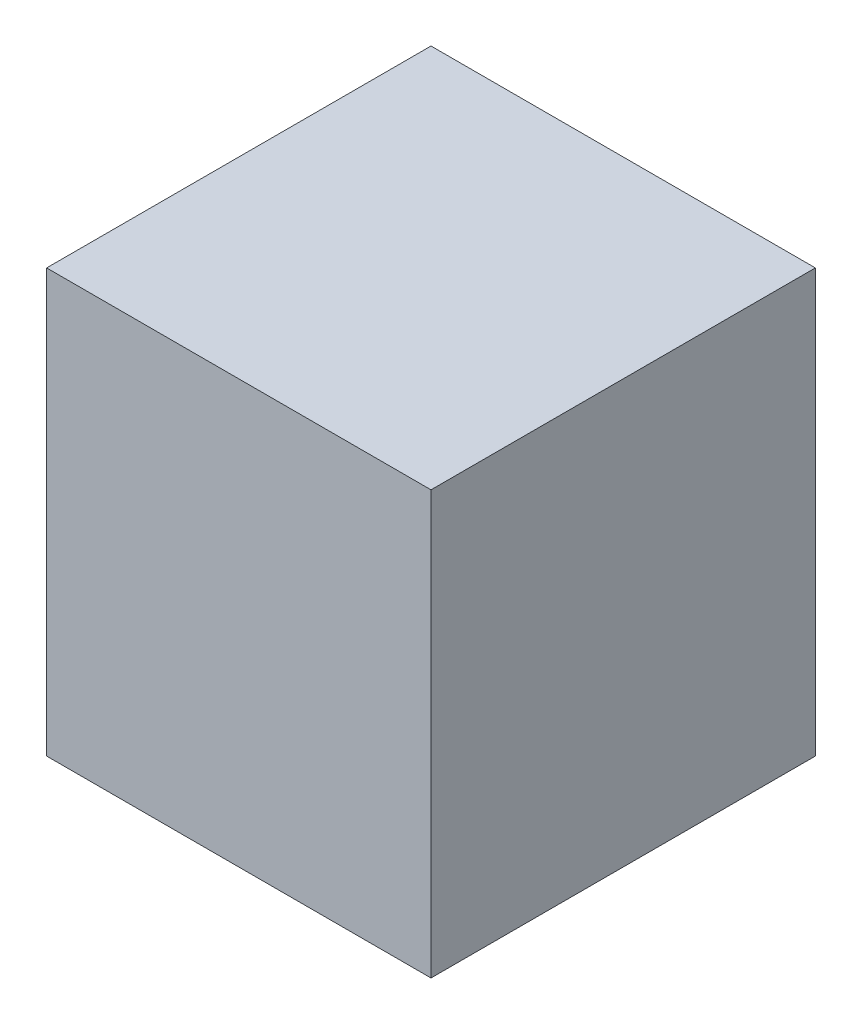
ISO-10303-21;
HEADER;
FILE_DESCRIPTION(('STEP AP214'),'2;1');
FILE_NAME('part.step','',(''),(''),'','','');
FILE_SCHEMA(('AUTOMOTIVE_DESIGN { 1 0 10303 214 1 1 1 1 }'));
ENDSEC;
DATA;
#1=APPLICATION_CONTEXT('core data for automotive mechanical design processes');
#2=APPLICATION_PROTOCOL_DEFINITION('international standard','automotive_design',2000,#1);
#3=PRODUCT_CONTEXT('',#1,'mechanical');
#4=PRODUCT('Part','Part','',(#3));
#5=PRODUCT_RELATED_PRODUCT_CATEGORY('part','',(#4));
#6=PRODUCT_DEFINITION_FORMATION('','',#4);
#7=PRODUCT_DEFINITION_CONTEXT('part definition',#1,'design');
#8=PRODUCT_DEFINITION('design','',#6,#7);
#9=PRODUCT_DEFINITION_SHAPE('','',#8);
#10=(LENGTH_UNIT() NAMED_UNIT(*) SI_UNIT(.MILLI.,.METRE.));
#11=(NAMED_UNIT(*) PLANE_ANGLE_UNIT() SI_UNIT($,.RADIAN.));
#12=(NAMED_UNIT(*) SI_UNIT($,.STERADIAN.) SOLID_ANGLE_UNIT());
#13=UNCERTAINTY_MEASURE_WITH_UNIT(LENGTH_MEASURE(1.E-05),#10,'distance_accuracy_value','');
#14=(GEOMETRIC_REPRESENTATION_CONTEXT(3) GLOBAL_UNCERTAINTY_ASSIGNED_CONTEXT((#13)) GLOBAL_UNIT_ASSIGNED_CONTEXT((#10,
#11,#12)) REPRESENTATION_CONTEXT('',''));
#15=CARTESIAN_POINT('',(0.,0.,0.));
#16=DIRECTION('',(0.,0.,1.));
#17=DIRECTION('',(1.,0.,0.));
#18=AXIS2_PLACEMENT_3D('',#15,#16,#17);
#19=CARTESIAN_POINT('',(-5.,11.,5.));
#20=DIRECTION('',(1.,0.,0.));
#21=DIRECTION('',(0.,0.,-1.));
#22=AXIS2_PLACEMENT_3D('',#19,#20,#21);
#23=PLANE('',#22);
#24=DIRECTION('',(0.,0.,1.));
#25=VECTOR('',#24,1.);
#26=CARTESIAN_POINT('',(-5.,0.,5.));
#27=LINE('',#26,#25);
#28=CARTESIAN_POINT('',(-5.,0.,-5.));
#29=VERTEX_POINT('',#28);
#30=CARTESIAN_POINT('',(-5.,0.,5.));
#31=VERTEX_POINT('',#30);
#32=EDGE_CURVE('E96',#29,#31,#27,.T.);
#33=ORIENTED_EDGE('',*,*,#32,.T.);
#34=DIRECTION('',(0.,-1.,0.));
#35=VECTOR('',#34,1.);
#36=CARTESIAN_POINT('',(-5.,11.,5.));
#37=LINE('',#36,#35);
#38=CARTESIAN_POINT('',(-5.,11.,5.));
#39=VERTEX_POINT('',#38);
#40=EDGE_CURVE('E11',#39,#31,#37,.T.);
#41=ORIENTED_EDGE('',*,*,#40,.F.);
#42=DIRECTION('',(0.,0.,1.));
#43=VECTOR('',#42,1.);
#44=CARTESIAN_POINT('',(-5.,11.,5.));
#45=LINE('',#44,#43);
#46=CARTESIAN_POINT('',(-5.,11.,-5.));
#47=VERTEX_POINT('',#46);
#48=EDGE_CURVE('E84',#47,#39,#45,.T.);
#49=ORIENTED_EDGE('',*,*,#48,.F.);
#50=DIRECTION('',(0.,-1.,0.));
#51=VECTOR('',#50,1.);
#52=CARTESIAN_POINT('',(-5.,11.,-5.));
#53=LINE('',#52,#51);
#54=EDGE_CURVE('E92',#47,#29,#53,.T.);
#55=ORIENTED_EDGE('',*,*,#54,.T.);
#56=EDGE_LOOP('',(#33,#41,#49,#55));
#57=FACE_BOUND('',#56,.T.);
#58=ADVANCED_FACE('F33',(#57),#23,.F.);
#59=CARTESIAN_POINT('',(5.,11.,5.));
#60=DIRECTION('',(0.,0.,-1.));
#61=DIRECTION('',(-1.,0.,0.));
#62=AXIS2_PLACEMENT_3D('',#59,#60,#61);
#63=PLANE('',#62);
#64=DIRECTION('',(1.,0.,0.));
#65=VECTOR('',#64,1.);
#66=CARTESIAN_POINT('',(5.,0.,5.));
#67=LINE('',#66,#65);
#68=CARTESIAN_POINT('',(5.,0.,5.));
#69=VERTEX_POINT('',#68);
#70=EDGE_CURVE('E88',#31,#69,#67,.T.);
#71=ORIENTED_EDGE('',*,*,#70,.T.);
#72=DIRECTION('',(0.,-1.,0.));
#73=VECTOR('',#72,1.);
#74=CARTESIAN_POINT('',(5.,11.,5.));
#75=LINE('',#74,#73);
#76=CARTESIAN_POINT('',(5.,11.,5.));
#77=VERTEX_POINT('',#76);
#78=EDGE_CURVE('E41',#77,#69,#75,.T.);
#79=ORIENTED_EDGE('',*,*,#78,.F.);
#80=DIRECTION('',(1.,0.,0.));
#81=VECTOR('',#80,1.);
#82=CARTESIAN_POINT('',(5.,11.,5.));
#83=LINE('',#82,#81);
#84=EDGE_CURVE('E79',#39,#77,#83,.T.);
#85=ORIENTED_EDGE('',*,*,#84,.F.);
#86=ORIENTED_EDGE('',*,*,#40,.T.);
#87=EDGE_LOOP('',(#71,#79,#85,#86));
#88=FACE_BOUND('',#87,.T.);
#89=ADVANCED_FACE('F87',(#88),#63,.F.);
#90=CARTESIAN_POINT('',(5.,11.,5.));
#91=DIRECTION('',(-1.,0.,0.));
#92=DIRECTION('',(0.,0.,1.));
#93=AXIS2_PLACEMENT_3D('',#90,#91,#92);
#94=PLANE('',#93);
#95=DIRECTION('',(0.,0.,-1.));
#96=VECTOR('',#95,1.);
#97=CARTESIAN_POINT('',(5.,0.,5.));
#98=LINE('',#97,#96);
#99=CARTESIAN_POINT('',(5.,0.,-5.));
#100=VERTEX_POINT('',#99);
#101=EDGE_CURVE('E66',#69,#100,#98,.T.);
#102=ORIENTED_EDGE('',*,*,#101,.T.);
#103=DIRECTION('',(0.,-1.,0.));
#104=VECTOR('',#103,1.);
#105=CARTESIAN_POINT('',(5.,11.,-5.));
#106=LINE('',#105,#104);
#107=CARTESIAN_POINT('',(5.,11.,-5.));
#108=VERTEX_POINT('',#107);
#109=EDGE_CURVE('E89',#108,#100,#106,.T.);
#110=ORIENTED_EDGE('',*,*,#109,.F.);
#111=DIRECTION('',(0.,0.,-1.));
#112=VECTOR('',#111,1.);
#113=CARTESIAN_POINT('',(5.,11.,5.));
#114=LINE('',#113,#112);
#115=EDGE_CURVE('E82',#77,#108,#114,.T.);
#116=ORIENTED_EDGE('',*,*,#115,.F.);
#117=ORIENTED_EDGE('',*,*,#78,.T.);
#118=EDGE_LOOP('',(#102,#110,#116,#117));
#119=FACE_BOUND('',#118,.T.);
#120=ADVANCED_FACE('F90',(#119),#94,.F.);
#121=CARTESIAN_POINT('',(5.,11.,-5.));
#122=DIRECTION('',(0.,0.,1.));
#123=DIRECTION('',(1.,0.,0.));
#124=AXIS2_PLACEMENT_3D('',#121,#122,#123);
#125=PLANE('',#124);
#126=DIRECTION('',(-1.,0.,0.));
#127=VECTOR('',#126,1.);
#128=CARTESIAN_POINT('',(5.,0.,-5.));
#129=LINE('',#128,#127);
#130=EDGE_CURVE('E72',#100,#29,#129,.T.);
#131=ORIENTED_EDGE('',*,*,#130,.T.);
#132=ORIENTED_EDGE('',*,*,#54,.F.);
#133=DIRECTION('',(-1.,0.,0.));
#134=VECTOR('',#133,1.);
#135=CARTESIAN_POINT('',(5.,11.,-5.));
#136=LINE('',#135,#134);
#137=EDGE_CURVE('E49',#108,#47,#136,.T.);
#138=ORIENTED_EDGE('',*,*,#137,.F.);
#139=ORIENTED_EDGE('',*,*,#109,.T.);
#140=EDGE_LOOP('',(#131,#132,#138,#139));
#141=FACE_BOUND('',#140,.T.);
#142=ADVANCED_FACE('F103',(#141),#125,.F.);
#143=CARTESIAN_POINT('',(-5.,11.,-5.));
#144=DIRECTION('',(0.,1.,0.));
#145=DIRECTION('',(0.,0.,1.));
#146=AXIS2_PLACEMENT_3D('',#143,#144,#145);
#147=PLANE('',#146);
#148=ORIENTED_EDGE('',*,*,#48,.T.);
#149=ORIENTED_EDGE('',*,*,#84,.T.);
#150=ORIENTED_EDGE('',*,*,#115,.T.);
#151=ORIENTED_EDGE('',*,*,#137,.T.);
#152=EDGE_LOOP('',(#148,#149,#150,#151));
#153=FACE_BOUND('',#152,.T.);
#154=ADVANCED_FACE('F80',(#153),#147,.T.);
#155=CARTESIAN_POINT('',(-5.,0.,-5.));
#156=DIRECTION('',(0.,1.,0.));
#157=DIRECTION('',(0.,0.,1.));
#158=AXIS2_PLACEMENT_3D('',#155,#156,#157);
#159=PLANE('',#158);
#160=ORIENTED_EDGE('',*,*,#32,.F.);
#161=ORIENTED_EDGE('',*,*,#130,.F.);
#162=ORIENTED_EDGE('',*,*,#101,.F.);
#163=ORIENTED_EDGE('',*,*,#70,.F.);
#164=EDGE_LOOP('',(#160,#161,#162,#163));
#165=FACE_BOUND('',#164,.T.);
#166=ADVANCED_FACE('F106',(#165),#159,.F.);
#167=CLOSED_SHELL('',(#58,#89,#120,#142,#154,#166));
#168=MANIFOLD_SOLID_BREP('B2',#167);
#169=ADVANCED_BREP_SHAPE_REPRESENTATION('',(#18,#168),#14);
#170=SHAPE_DEFINITION_REPRESENTATION(#9,#169);
ENDSEC;
END-ISO-10303-21;
